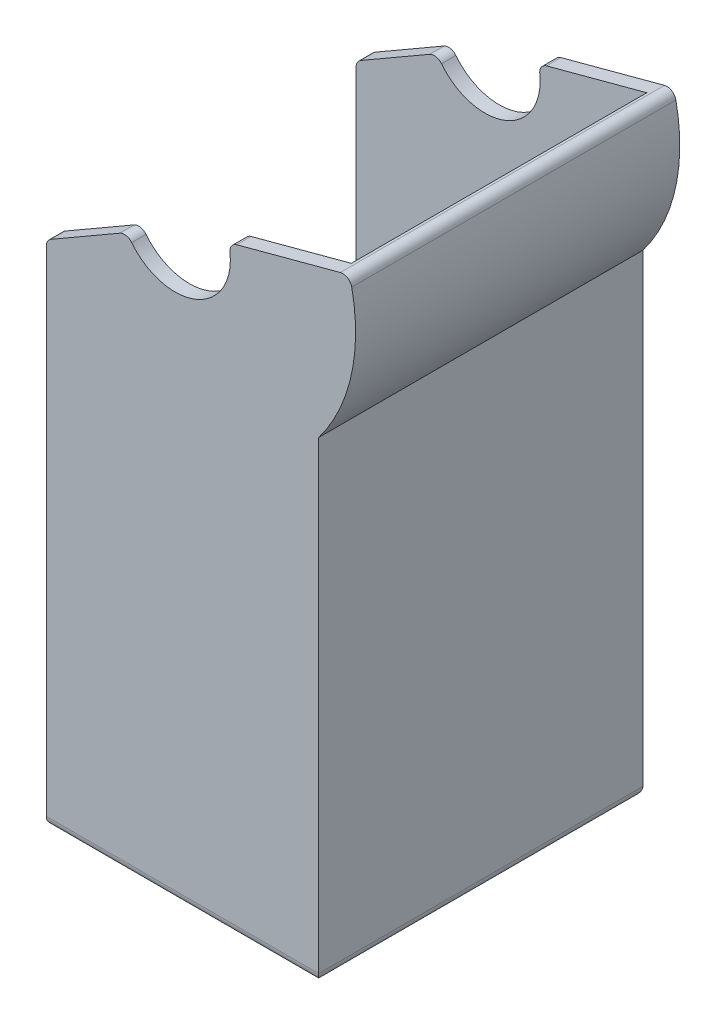
ISO-10303-21;
HEADER;
FILE_DESCRIPTION(('STEP AP214'),'2;1');
FILE_NAME('part.step','',(''),(''),'','','');
FILE_SCHEMA(('AUTOMOTIVE_DESIGN { 1 0 10303 214 1 1 1 1 }'));
ENDSEC;
DATA;
#1=APPLICATION_CONTEXT('core data for automotive mechanical design processes');
#2=APPLICATION_PROTOCOL_DEFINITION('international standard','automotive_design',2000,#1);
#3=PRODUCT_CONTEXT('',#1,'mechanical');
#4=PRODUCT('Part','Part','',(#3));
#5=PRODUCT_RELATED_PRODUCT_CATEGORY('part','',(#4));
#6=PRODUCT_DEFINITION_FORMATION('','',#4);
#7=PRODUCT_DEFINITION_CONTEXT('part definition',#1,'design');
#8=PRODUCT_DEFINITION('design','',#6,#7);
#9=PRODUCT_DEFINITION_SHAPE('','',#8);
#10=(LENGTH_UNIT() NAMED_UNIT(*) SI_UNIT(.MILLI.,.METRE.));
#11=(NAMED_UNIT(*) PLANE_ANGLE_UNIT() SI_UNIT($,.RADIAN.));
#12=(NAMED_UNIT(*) SI_UNIT($,.STERADIAN.) SOLID_ANGLE_UNIT());
#13=UNCERTAINTY_MEASURE_WITH_UNIT(LENGTH_MEASURE(1.E-05),#10,'distance_accuracy_value','');
#14=(GEOMETRIC_REPRESENTATION_CONTEXT(3) GLOBAL_UNCERTAINTY_ASSIGNED_CONTEXT((#13)) GLOBAL_UNIT_ASSIGNED_CONTEXT((#10,
#11,#12)) REPRESENTATION_CONTEXT('',''));
#15=CARTESIAN_POINT('',(0.,0.,0.));
#16=DIRECTION('',(0.,0.,1.));
#17=DIRECTION('',(1.,0.,0.));
#18=AXIS2_PLACEMENT_3D('',#15,#16,#17);
#19=CARTESIAN_POINT('',(38.97,-158.24,238.319982711232));
#20=DIRECTION('',(0.,-1.,0.));
#21=DIRECTION('',(0.,0.,-1.));
#22=AXIS2_PLACEMENT_3D('',#19,#20,#21);
#23=PLANE('',#22);
#24=DIRECTION('',(0.,0.,-1.));
#25=VECTOR('',#24,1.);
#26=CARTESIAN_POINT('',(36.47,-158.24,238.319982711232));
#27=LINE('',#26,#25);
#28=CARTESIAN_POINT('',(36.47,-158.24,2.5));
#29=VERTEX_POINT('',#28);
#30=CARTESIAN_POINT('',(36.47,-158.24,85.5));
#31=VERTEX_POINT('',#30);
#32=EDGE_CURVE('E282',#29,#31,#27,.F.);
#33=ORIENTED_EDGE('',*,*,#32,.T.);
#34=DIRECTION('',(-1.,0.,0.));
#35=VECTOR('',#34,1.);
#36=CARTESIAN_POINT('',(38.97,-158.24,85.5));
#37=LINE('',#36,#35);
#38=CARTESIAN_POINT('',(-34.97,-158.24,85.5));
#39=VERTEX_POINT('',#38);
#40=EDGE_CURVE('E203',#31,#39,#37,.T.);
#41=ORIENTED_EDGE('',*,*,#40,.T.);
#42=DIRECTION('',(0.,0.,-1.));
#43=VECTOR('',#42,1.);
#44=CARTESIAN_POINT('',(-34.97,-158.24,238.319982711232));
#45=LINE('',#44,#43);
#46=CARTESIAN_POINT('',(-34.97,-158.24,84.1));
#47=VERTEX_POINT('',#46);
#48=EDGE_CURVE('E197',#39,#47,#45,.T.);
#49=ORIENTED_EDGE('',*,*,#48,.T.);
#50=DIRECTION('',(-1.,0.,0.));
#51=VECTOR('',#50,1.);
#52=CARTESIAN_POINT('',(34.97,-158.24,84.1));
#53=LINE('',#52,#51);
#54=CARTESIAN_POINT('',(34.97,-158.24,84.1));
#55=VERTEX_POINT('',#54);
#56=EDGE_CURVE('E201',#55,#47,#53,.T.);
#57=ORIENTED_EDGE('',*,*,#56,.F.);
#58=DIRECTION('',(0.,0.,1.));
#59=VECTOR('',#58,1.);
#60=CARTESIAN_POINT('',(34.97,-158.24,-173.007228750709));
#61=LINE('',#60,#59);
#62=CARTESIAN_POINT('',(34.97,-158.24,3.89999999999993));
#63=VERTEX_POINT('',#62);
#64=EDGE_CURVE('E216',#63,#55,#61,.T.);
#65=ORIENTED_EDGE('',*,*,#64,.F.);
#66=DIRECTION('',(1.,0.,0.));
#67=VECTOR('',#66,1.);
#68=CARTESIAN_POINT('',(34.97,-158.24,3.89999999999999));
#69=LINE('',#68,#67);
#70=CARTESIAN_POINT('',(-34.97,-158.24,3.89999999999999));
#71=VERTEX_POINT('',#70);
#72=EDGE_CURVE('E229',#71,#63,#69,.T.);
#73=ORIENTED_EDGE('',*,*,#72,.F.);
#74=CARTESIAN_POINT('',(-34.97,-158.24,2.5));
#75=VERTEX_POINT('',#74);
#76=EDGE_CURVE('E206',#71,#75,#45,.T.);
#77=ORIENTED_EDGE('',*,*,#76,.T.);
#78=DIRECTION('',(-1.,0.,0.));
#79=VECTOR('',#78,1.);
#80=CARTESIAN_POINT('',(38.97,-158.24,2.5));
#81=LINE('',#80,#79);
#82=EDGE_CURVE('E284',#75,#29,#81,.F.);
#83=ORIENTED_EDGE('',*,*,#82,.T.);
#84=EDGE_LOOP('',(#33,#41,#49,#57,#65,#73,#77,#83));
#85=FACE_BOUND('',#84,.T.);
#86=ADVANCED_FACE('F40',(#85),#23,.T.);
#87=CARTESIAN_POINT('',(0.,0.,209.168433657794));
#88=DIRECTION('',(0.499999999999998,-0.86602540378444,0.));
#89=DIRECTION('',(0.86602540378444,0.499999999999998,0.));
#90=AXIS2_PLACEMENT_3D('',#87,#88,#89);
#91=PLANE('',#90);
#92=DIRECTION('',(-0.86602540378444,-0.499999999999998,0.));
#93=VECTOR('',#92,1.);
#94=CARTESIAN_POINT('',(0.,0.,88.));
#95=LINE('',#94,#93);
#96=CARTESIAN_POINT('',(-15.,-8.66025403784434,88.));
#97=VERTEX_POINT('',#96);
#98=CARTESIAN_POINT('',(-33.72,-19.4682510770741,88.));
#99=VERTEX_POINT('',#98);
#100=EDGE_CURVE('E265',#97,#99,#95,.T.);
#101=ORIENTED_EDGE('',*,*,#100,.F.);
#102=DIRECTION('',(0.,0.,-1.));
#103=VECTOR('',#102,1.);
#104=CARTESIAN_POINT('',(-15.,-8.66025403784434,209.168433657794));
#105=LINE('',#104,#103);
#106=CARTESIAN_POINT('',(-15.,-8.66025403784434,84.1));
#107=VERTEX_POINT('',#106);
#108=EDGE_CURVE('E340',#97,#107,#105,.T.);
#109=ORIENTED_EDGE('',*,*,#108,.T.);
#110=DIRECTION('',(-0.86602540378444,-0.499999999999998,0.));
#111=VECTOR('',#110,1.);
#112=CARTESIAN_POINT('',(0.,0.,84.1));
#113=LINE('',#112,#111);
#114=CARTESIAN_POINT('',(-33.72,-19.4682510770741,84.1));
#115=VERTEX_POINT('',#114);
#116=EDGE_CURVE('E274',#107,#115,#113,.T.);
#117=ORIENTED_EDGE('',*,*,#116,.T.);
#118=DIRECTION('',(0.,0.,-1.));
#119=VECTOR('',#118,1.);
#120=CARTESIAN_POINT('',(-33.72,-19.468251077074,88.));
#121=LINE('',#120,#119);
#122=EDGE_CURVE('E338',#115,#99,#121,.F.);
#123=ORIENTED_EDGE('',*,*,#122,.T.);
#124=EDGE_LOOP('',(#101,#109,#117,#123));
#125=FACE_BOUND('',#124,.T.);
#126=ADVANCED_FACE('F401',(#125),#91,.F.);
#127=DIRECTION('',(-0.86602540378444,-0.499999999999998,0.));
#128=VECTOR('',#127,1.);
#129=CARTESIAN_POINT('',(0.,0.,0.));
#130=LINE('',#129,#128);
#131=CARTESIAN_POINT('',(-15.,-8.66025403784434,0.));
#132=VERTEX_POINT('',#131);
#133=CARTESIAN_POINT('',(-33.72,-19.468251077074,0.));
#134=VERTEX_POINT('',#133);
#135=EDGE_CURVE('E256',#132,#134,#130,.T.);
#136=ORIENTED_EDGE('',*,*,#135,.T.);
#137=DIRECTION('',(0.,0.,-1.));
#138=VECTOR('',#137,1.);
#139=CARTESIAN_POINT('',(-33.72,-19.468251077074,3.89999999999999));
#140=LINE('',#139,#138);
#141=CARTESIAN_POINT('',(-33.72,-19.4682510770741,3.89999999999999));
#142=VERTEX_POINT('',#141);
#143=EDGE_CURVE('E346',#134,#142,#140,.F.);
#144=ORIENTED_EDGE('',*,*,#143,.T.);
#145=DIRECTION('',(-0.86602540378444,-0.499999999999998,0.));
#146=VECTOR('',#145,1.);
#147=CARTESIAN_POINT('',(0.,0.,3.89999999999999));
#148=LINE('',#147,#146);
#149=CARTESIAN_POINT('',(-15.,-8.66025403784434,3.89999999999999));
#150=VERTEX_POINT('',#149);
#151=EDGE_CURVE('E279',#150,#142,#148,.T.);
#152=ORIENTED_EDGE('',*,*,#151,.F.);
#153=DIRECTION('',(0.,0.,-1.));
#154=VECTOR('',#153,1.);
#155=CARTESIAN_POINT('',(-15.,-8.66025403784434,209.168433657794));
#156=LINE('',#155,#154);
#157=EDGE_CURVE('E343',#150,#132,#156,.T.);
#158=ORIENTED_EDGE('',*,*,#157,.T.);
#159=EDGE_LOOP('',(#136,#144,#152,#158));
#160=FACE_BOUND('',#159,.T.);
#161=ADVANCED_FACE('F438',(#160),#91,.F.);
#162=CARTESIAN_POINT('',(0.,0.,88.));
#163=DIRECTION('',(0.,0.,1.));
#164=DIRECTION('',(1.,0.,0.));
#165=AXIS2_PLACEMENT_3D('',#162,#163,#164);
#166=PLANE('',#165);
#167=DIRECTION('',(0.,1.,0.));
#168=VECTOR('',#167,1.);
#169=CARTESIAN_POINT('',(-34.97,11.7762665521649,88.));
#170=LINE('',#169,#168);
#171=CARTESIAN_POINT('',(-34.97,-155.74,88.));
#172=VERTEX_POINT('',#171);
#173=CARTESIAN_POINT('',(-34.97,-21.6333145865351,88.));
#174=VERTEX_POINT('',#173);
#175=EDGE_CURVE('E374',#172,#174,#170,.T.);
#176=ORIENTED_EDGE('',*,*,#175,.F.);
#177=DIRECTION('',(-1.,0.,0.));
#178=VECTOR('',#177,1.);
#179=CARTESIAN_POINT('',(0.,-155.74,88.));
#180=LINE('',#179,#178);
#181=CARTESIAN_POINT('',(38.97,-155.74,88.));
#182=VERTEX_POINT('',#181);
#183=EDGE_CURVE('E298',#172,#182,#180,.F.);
#184=ORIENTED_EDGE('',*,*,#183,.T.);
#185=DIRECTION('',(0.,-1.,0.));
#186=VECTOR('',#185,1.);
#187=CARTESIAN_POINT('',(38.97,-158.24,88.));
#188=LINE('',#187,#186);
#189=CARTESIAN_POINT('',(38.97,-29.7041933066697,88.));
#190=VERTEX_POINT('',#189);
#191=EDGE_CURVE('E253',#190,#182,#188,.T.);
#192=ORIENTED_EDGE('',*,*,#191,.F.);
#193=CARTESIAN_POINT('',(0.,0.,88.));
#194=DIRECTION('',(0.,0.,1.));
#195=DIRECTION('',(1.,0.,0.));
#196=AXIS2_PLACEMENT_3D('',#193,#194,#195);
#197=CIRCLE('',#196,49.);
#198=CARTESIAN_POINT('',(47.9437467146203,10.1191477390311,88.));
#199=VERTEX_POINT('',#198);
#200=EDGE_CURVE('E271',#190,#199,#197,.T.);
#201=ORIENTED_EDGE('',*,*,#200,.T.);
#202=CARTESIAN_POINT('',(45.4976371883641,9.60286469112135,88.));
#203=DIRECTION('',(0.,0.,1.));
#204=DIRECTION('',(1.,0.,0.));
#205=AXIS2_PLACEMENT_3D('',#202,#203,#204);
#206=CIRCLE('',#205,2.5);
#207=CARTESIAN_POINT('',(44.8505895756078,12.017679256844,88.));
#208=VERTEX_POINT('',#207);
#209=EDGE_CURVE('E296',#199,#208,#206,.T.);
#210=ORIENTED_EDGE('',*,*,#209,.T.);
#211=DIRECTION('',(-0.965925826289067,-0.258819045102524,0.));
#212=VECTOR('',#211,1.);
#213=CARTESIAN_POINT('',(0.,0.,88.));
#214=LINE('',#213,#212);
#215=CARTESIAN_POINT('',(16.7303260747561,4.48287736084033,88.));
#216=VERTEX_POINT('',#215);
#217=EDGE_CURVE('E262',#208,#216,#214,.T.);
#218=ORIENTED_EDGE('',*,*,#217,.T.);
#219=CARTESIAN_POINT('',(17.3773736875125,2.06806279511766,88.));
#220=DIRECTION('',(0.,0.,1.));
#221=DIRECTION('',(1.,0.,0.));
#222=AXIS2_PLACEMENT_3D('',#219,#220,#221);
#223=CIRCLE('',#222,2.5);
#224=CARTESIAN_POINT('',(14.8948917321535,1.77262525295799,88.));
#225=VERTEX_POINT('',#224);
#226=EDGE_CURVE('E294',#216,#225,#223,.T.);
#227=ORIENTED_EDGE('',*,*,#226,.T.);
#228=CARTESIAN_POINT('',(0.,0.,88.));
#229=DIRECTION('',(0.,0.,-1.));
#230=DIRECTION('',(-1.,0.,0.));
#231=AXIS2_PLACEMENT_3D('',#228,#229,#230);
#232=CIRCLE('',#231,15.);
#233=CARTESIAN_POINT('',(-11.7857142857143,-9.2788436119761,88.));
#234=VERTEX_POINT('',#233);
#235=EDGE_CURVE('E364',#225,#234,#232,.T.);
#236=ORIENTED_EDGE('',*,*,#235,.T.);
#237=CARTESIAN_POINT('',(-13.75,-10.8253175473054,88.));
#238=DIRECTION('',(0.,0.,1.));
#239=DIRECTION('',(1.,0.,0.));
#240=AXIS2_PLACEMENT_3D('',#237,#238,#239);
#241=CIRCLE('',#240,2.5);
#242=EDGE_CURVE('E292',#234,#97,#241,.T.);
#243=ORIENTED_EDGE('',*,*,#242,.T.);
#244=ORIENTED_EDGE('',*,*,#100,.T.);
#245=CARTESIAN_POINT('',(-32.47,-21.6333145865351,88.));
#246=DIRECTION('',(0.,0.,1.));
#247=DIRECTION('',(1.,0.,0.));
#248=AXIS2_PLACEMENT_3D('',#245,#246,#247);
#249=CIRCLE('',#248,2.5);
#250=EDGE_CURVE('E290',#99,#174,#249,.T.);
#251=ORIENTED_EDGE('',*,*,#250,.T.);
#252=EDGE_LOOP('',(#176,#184,#192,#201,#210,#218,#227,#236,#243,#244,#251));
#253=FACE_BOUND('',#252,.T.);
#254=ADVANCED_FACE('F393',(#253),#166,.T.);
#255=CARTESIAN_POINT('',(0.,0.,0.));
#256=DIRECTION('',(0.,0.,1.));
#257=DIRECTION('',(1.,0.,0.));
#258=AXIS2_PLACEMENT_3D('',#255,#256,#257);
#259=PLANE('',#258);
#260=DIRECTION('',(0.,-1.,0.));
#261=VECTOR('',#260,1.);
#262=CARTESIAN_POINT('',(38.97,-158.24,0.));
#263=LINE('',#262,#261);
#264=CARTESIAN_POINT('',(38.97,-29.7041933066697,0.));
#265=VERTEX_POINT('',#264);
#266=CARTESIAN_POINT('',(38.97,-155.74,0.));
#267=VERTEX_POINT('',#266);
#268=EDGE_CURVE('E249',#265,#267,#263,.T.);
#269=ORIENTED_EDGE('',*,*,#268,.T.);
#270=DIRECTION('',(-1.,0.,0.));
#271=VECTOR('',#270,1.);
#272=CARTESIAN_POINT('',(-34.97,-155.74,0.));
#273=LINE('',#272,#271);
#274=CARTESIAN_POINT('',(-34.97,-155.74,0.));
#275=VERTEX_POINT('',#274);
#276=EDGE_CURVE('E308',#267,#275,#273,.T.);
#277=ORIENTED_EDGE('',*,*,#276,.T.);
#278=DIRECTION('',(0.,-1.,0.));
#279=VECTOR('',#278,1.);
#280=CARTESIAN_POINT('',(-34.97,11.7762665521649,0.));
#281=LINE('',#280,#279);
#282=CARTESIAN_POINT('',(-34.97,-21.6333145865351,0.));
#283=VERTEX_POINT('',#282);
#284=EDGE_CURVE('E376',#283,#275,#281,.T.);
#285=ORIENTED_EDGE('',*,*,#284,.F.);
#286=CARTESIAN_POINT('',(-32.47,-21.6333145865351,0.));
#287=DIRECTION('',(0.,0.,1.));
#288=DIRECTION('',(1.,0.,0.));
#289=AXIS2_PLACEMENT_3D('',#286,#287,#288);
#290=CIRCLE('',#289,2.5);
#291=EDGE_CURVE('E304',#283,#134,#290,.F.);
#292=ORIENTED_EDGE('',*,*,#291,.T.);
#293=ORIENTED_EDGE('',*,*,#135,.F.);
#294=CARTESIAN_POINT('',(-13.75,-10.8253175473054,0.));
#295=DIRECTION('',(0.,0.,1.));
#296=DIRECTION('',(1.,0.,0.));
#297=AXIS2_PLACEMENT_3D('',#294,#295,#296);
#298=CIRCLE('',#297,2.5);
#299=CARTESIAN_POINT('',(-11.7857142857143,-9.2788436119761,0.));
#300=VERTEX_POINT('',#299);
#301=EDGE_CURVE('E302',#132,#300,#298,.F.);
#302=ORIENTED_EDGE('',*,*,#301,.T.);
#303=CARTESIAN_POINT('',(0.,0.,0.));
#304=DIRECTION('',(0.,0.,-1.));
#305=DIRECTION('',(-1.,0.,0.));
#306=AXIS2_PLACEMENT_3D('',#303,#304,#305);
#307=CIRCLE('',#306,15.);
#308=CARTESIAN_POINT('',(14.8948917321535,1.77262525295799,0.));
#309=VERTEX_POINT('',#308);
#310=EDGE_CURVE('E359',#309,#300,#307,.T.);
#311=ORIENTED_EDGE('',*,*,#310,.F.);
#312=CARTESIAN_POINT('',(17.3773736875125,2.06806279511766,0.));
#313=DIRECTION('',(0.,0.,1.));
#314=DIRECTION('',(1.,0.,0.));
#315=AXIS2_PLACEMENT_3D('',#312,#313,#314);
#316=CIRCLE('',#315,2.5);
#317=CARTESIAN_POINT('',(16.7303260747561,4.48287736084033,0.));
#318=VERTEX_POINT('',#317);
#319=EDGE_CURVE('E300',#309,#318,#316,.F.);
#320=ORIENTED_EDGE('',*,*,#319,.T.);
#321=DIRECTION('',(-0.965925826289067,-0.258819045102524,0.));
#322=VECTOR('',#321,1.);
#323=CARTESIAN_POINT('',(0.,0.,0.));
#324=LINE('',#323,#322);
#325=CARTESIAN_POINT('',(44.8505895756078,12.017679256844,0.));
#326=VERTEX_POINT('',#325);
#327=EDGE_CURVE('E259',#326,#318,#324,.T.);
#328=ORIENTED_EDGE('',*,*,#327,.F.);
#329=CARTESIAN_POINT('',(45.4976371883641,9.60286469112135,0.));
#330=DIRECTION('',(0.,0.,1.));
#331=DIRECTION('',(1.,0.,0.));
#332=AXIS2_PLACEMENT_3D('',#329,#330,#331);
#333=CIRCLE('',#332,2.5);
#334=CARTESIAN_POINT('',(47.9437467146203,10.1191477390311,0.));
#335=VERTEX_POINT('',#334);
#336=EDGE_CURVE('E306',#326,#335,#333,.F.);
#337=ORIENTED_EDGE('',*,*,#336,.T.);
#338=CARTESIAN_POINT('',(0.,0.,0.));
#339=DIRECTION('',(0.,0.,1.));
#340=DIRECTION('',(1.,0.,0.));
#341=AXIS2_PLACEMENT_3D('',#338,#339,#340);
#342=CIRCLE('',#341,49.);
#343=EDGE_CURVE('E268',#265,#335,#342,.T.);
#344=ORIENTED_EDGE('',*,*,#343,.F.);
#345=EDGE_LOOP('',(#269,#277,#285,#292,#293,#302,#311,#320,#328,#337,#344));
#346=FACE_BOUND('',#345,.T.);
#347=ADVANCED_FACE('F436',(#346),#259,.F.);
#348=CARTESIAN_POINT('',(0.,0.,3.9));
#349=DIRECTION('',(0.,0.,1.));
#350=DIRECTION('',(1.,0.,0.));
#351=AXIS2_PLACEMENT_3D('',#348,#349,#350);
#352=PLANE('',#351);
#353=ORIENTED_EDGE('',*,*,#151,.T.);
#354=CARTESIAN_POINT('',(-32.47,-21.6333145865351,3.9));
#355=DIRECTION('',(0.,0.,1.));
#356=DIRECTION('',(1.,0.,0.));
#357=AXIS2_PLACEMENT_3D('',#354,#355,#356);
#358=CIRCLE('',#357,2.5);
#359=CARTESIAN_POINT('',(-34.97,-21.6333145865351,3.89999999999999));
#360=VERTEX_POINT('',#359);
#361=EDGE_CURVE('E351',#142,#360,#358,.T.);
#362=ORIENTED_EDGE('',*,*,#361,.T.);
#363=DIRECTION('',(0.,-1.,0.));
#364=VECTOR('',#363,1.);
#365=CARTESIAN_POINT('',(-34.97,0.,3.89999999999999));
#366=LINE('',#365,#364);
#367=EDGE_CURVE('E228',#360,#71,#366,.T.);
#368=ORIENTED_EDGE('',*,*,#367,.T.);
#369=ORIENTED_EDGE('',*,*,#72,.T.);
#370=DIRECTION('',(0.,1.,0.));
#371=VECTOR('',#370,1.);
#372=CARTESIAN_POINT('',(34.97,0.,3.89999999999999));
#373=LINE('',#372,#371);
#374=CARTESIAN_POINT('',(34.97,-29.1092614128219,3.89999999999999));
#375=VERTEX_POINT('',#374);
#376=EDGE_CURVE('E225',#63,#375,#373,.T.);
#377=ORIENTED_EDGE('',*,*,#376,.T.);
#378=CARTESIAN_POINT('',(0.,0.,3.89999999999999));
#379=DIRECTION('',(0.,0.,1.));
#380=DIRECTION('',(1.,0.,0.));
#381=AXIS2_PLACEMENT_3D('',#378,#379,#380);
#382=CIRCLE('',#381,45.5);
#383=CARTESIAN_POINT('',(43.9496250961526,11.7762665521649,3.89999999999999));
#384=VERTEX_POINT('',#383);
#385=EDGE_CURVE('E239',#375,#384,#382,.T.);
#386=ORIENTED_EDGE('',*,*,#385,.T.);
#387=DIRECTION('',(-0.965925826289067,-0.258819045102524,0.));
#388=VECTOR('',#387,1.);
#389=CARTESIAN_POINT('',(0.,0.,3.89999999999999));
#390=LINE('',#389,#388);
#391=CARTESIAN_POINT('',(16.7303260747561,4.48287736084033,3.89999999999999));
#392=VERTEX_POINT('',#391);
#393=EDGE_CURVE('E244',#384,#392,#390,.T.);
#394=ORIENTED_EDGE('',*,*,#393,.T.);
#395=CARTESIAN_POINT('',(17.3773736875125,2.06806279511766,3.9));
#396=DIRECTION('',(0.,0.,1.));
#397=DIRECTION('',(1.,0.,0.));
#398=AXIS2_PLACEMENT_3D('',#395,#396,#397);
#399=CIRCLE('',#398,2.5);
#400=CARTESIAN_POINT('',(14.8948917321535,1.77262525295799,3.9));
#401=VERTEX_POINT('',#400);
#402=EDGE_CURVE('E57',#392,#401,#399,.T.);
#403=ORIENTED_EDGE('',*,*,#402,.T.);
#404=CARTESIAN_POINT('',(0.,0.,3.9));
#405=DIRECTION('',(0.,0.,1.));
#406=DIRECTION('',(1.,0.,0.));
#407=AXIS2_PLACEMENT_3D('',#404,#405,#406);
#408=CIRCLE('',#407,15.);
#409=CARTESIAN_POINT('',(-11.7857142857143,-9.2788436119761,3.9));
#410=VERTEX_POINT('',#409);
#411=EDGE_CURVE('E372',#410,#401,#408,.T.);
#412=ORIENTED_EDGE('',*,*,#411,.F.);
#413=CARTESIAN_POINT('',(-13.75,-10.8253175473054,3.9));
#414=DIRECTION('',(0.,0.,1.));
#415=DIRECTION('',(1.,0.,0.));
#416=AXIS2_PLACEMENT_3D('',#413,#414,#415);
#417=CIRCLE('',#416,2.5);
#418=EDGE_CURVE('E349',#410,#150,#417,.T.);
#419=ORIENTED_EDGE('',*,*,#418,.T.);
#420=EDGE_LOOP('',(#353,#362,#368,#369,#377,#386,#394,#403,#412,#419));
#421=FACE_BOUND('',#420,.T.);
#422=ADVANCED_FACE('F427',(#421),#352,.T.);
#423=CARTESIAN_POINT('',(0.,0.,84.1));
#424=DIRECTION('',(0.,0.,1.));
#425=DIRECTION('',(1.,0.,0.));
#426=AXIS2_PLACEMENT_3D('',#423,#424,#425);
#427=PLANE('',#426);
#428=CARTESIAN_POINT('',(0.,0.,84.1));
#429=DIRECTION('',(0.,0.,1.));
#430=DIRECTION('',(1.,0.,0.));
#431=AXIS2_PLACEMENT_3D('',#428,#429,#430);
#432=CIRCLE('',#431,15.);
#433=CARTESIAN_POINT('',(-11.7857142857143,-9.2788436119761,84.1));
#434=VERTEX_POINT('',#433);
#435=CARTESIAN_POINT('',(14.8948917321535,1.77262525295799,84.1));
#436=VERTEX_POINT('',#435);
#437=EDGE_CURVE('E368',#434,#436,#432,.T.);
#438=ORIENTED_EDGE('',*,*,#437,.T.);
#439=CARTESIAN_POINT('',(17.3773736875125,2.06806279511766,84.1));
#440=DIRECTION('',(0.,0.,1.));
#441=DIRECTION('',(1.,0.,0.));
#442=AXIS2_PLACEMENT_3D('',#439,#440,#441);
#443=CIRCLE('',#442,2.5);
#444=CARTESIAN_POINT('',(16.7303260747561,4.48287736084033,84.1));
#445=VERTEX_POINT('',#444);
#446=EDGE_CURVE('E336',#436,#445,#443,.F.);
#447=ORIENTED_EDGE('',*,*,#446,.T.);
#448=DIRECTION('',(-0.965925826289067,-0.258819045102524,0.));
#449=VECTOR('',#448,1.);
#450=CARTESIAN_POINT('',(0.,0.,84.1));
#451=LINE('',#450,#449);
#452=CARTESIAN_POINT('',(43.9496250961526,11.7762665521649,84.1));
#453=VERTEX_POINT('',#452);
#454=EDGE_CURVE('E241',#453,#445,#451,.T.);
#455=ORIENTED_EDGE('',*,*,#454,.F.);
#456=CARTESIAN_POINT('',(0.,0.,84.1));
#457=DIRECTION('',(0.,0.,1.));
#458=DIRECTION('',(1.,0.,0.));
#459=AXIS2_PLACEMENT_3D('',#456,#457,#458);
#460=CIRCLE('',#459,45.5);
#461=CARTESIAN_POINT('',(34.97,-29.1092614128219,84.1));
#462=VERTEX_POINT('',#461);
#463=EDGE_CURVE('E237',#453,#462,#460,.F.);
#464=ORIENTED_EDGE('',*,*,#463,.T.);
#465=DIRECTION('',(0.,-1.,0.));
#466=VECTOR('',#465,1.);
#467=CARTESIAN_POINT('',(34.97,0.,84.1));
#468=LINE('',#467,#466);
#469=EDGE_CURVE('E205',#462,#55,#468,.T.);
#470=ORIENTED_EDGE('',*,*,#469,.T.);
#471=ORIENTED_EDGE('',*,*,#56,.T.);
#472=DIRECTION('',(0.,1.,0.));
#473=VECTOR('',#472,1.);
#474=CARTESIAN_POINT('',(-34.97,0.,84.1));
#475=LINE('',#474,#473);
#476=CARTESIAN_POINT('',(-34.97,-21.6333145865351,84.1));
#477=VERTEX_POINT('',#476);
#478=EDGE_CURVE('E210',#47,#477,#475,.T.);
#479=ORIENTED_EDGE('',*,*,#478,.T.);
#480=CARTESIAN_POINT('',(-32.47,-21.6333145865351,84.1));
#481=DIRECTION('',(0.,0.,1.));
#482=DIRECTION('',(1.,0.,0.));
#483=AXIS2_PLACEMENT_3D('',#480,#481,#482);
#484=CIRCLE('',#483,2.5);
#485=EDGE_CURVE('E332',#477,#115,#484,.F.);
#486=ORIENTED_EDGE('',*,*,#485,.T.);
#487=ORIENTED_EDGE('',*,*,#116,.F.);
#488=CARTESIAN_POINT('',(-13.75,-10.8253175473054,84.1));
#489=DIRECTION('',(0.,0.,1.));
#490=DIRECTION('',(1.,0.,0.));
#491=AXIS2_PLACEMENT_3D('',#488,#489,#490);
#492=CIRCLE('',#491,2.5);
#493=EDGE_CURVE('E334',#107,#434,#492,.F.);
#494=ORIENTED_EDGE('',*,*,#493,.T.);
#495=EDGE_LOOP('',(#438,#447,#455,#464,#470,#471,#479,#486,#487,#494));
#496=FACE_BOUND('',#495,.T.);
#497=ADVANCED_FACE('F220',(#496),#427,.F.);
#498=CARTESIAN_POINT('',(0.,0.,-128.693434175952));
#499=DIRECTION('',(0.,0.,1.));
#500=DIRECTION('',(1.,0.,0.));
#501=AXIS2_PLACEMENT_3D('',#498,#499,#500);
#502=CYLINDRICAL_SURFACE('',#501,45.5);
#503=ORIENTED_EDGE('',*,*,#385,.F.);
#504=DIRECTION('',(0.,0.,1.));
#505=VECTOR('',#504,1.);
#506=CARTESIAN_POINT('',(34.97,-29.1092614128219,-128.693434175952));
#507=LINE('',#506,#505);
#508=EDGE_CURVE('E231',#375,#462,#507,.T.);
#509=ORIENTED_EDGE('',*,*,#508,.T.);
#510=ORIENTED_EDGE('',*,*,#463,.F.);
#511=DIRECTION('',(0.,0.,1.));
#512=VECTOR('',#511,1.);
#513=CARTESIAN_POINT('',(43.9496250961526,11.7762665521649,-128.693434175952));
#514=LINE('',#513,#512);
#515=EDGE_CURVE('E246',#453,#384,#514,.F.);
#516=ORIENTED_EDGE('',*,*,#515,.T.);
#517=EDGE_LOOP('',(#503,#509,#510,#516));
#518=FACE_BOUND('',#517,.T.);
#519=ADVANCED_FACE('F424',(#518),#502,.F.);
#520=CARTESIAN_POINT('',(0.,0.,209.168433657794));
#521=DIRECTION('',(0.258819045102524,-0.965925826289067,0.));
#522=DIRECTION('',(0.965925826289067,0.258819045102524,0.));
#523=AXIS2_PLACEMENT_3D('',#520,#521,#522);
#524=PLANE('',#523);
#525=ORIENTED_EDGE('',*,*,#217,.F.);
#526=DIRECTION('',(0.,0.,-1.));
#527=VECTOR('',#526,1.);
#528=CARTESIAN_POINT('',(44.8505895756078,12.017679256844,209.168433657794));
#529=LINE('',#528,#527);
#530=EDGE_CURVE('E323',#208,#326,#529,.T.);
#531=ORIENTED_EDGE('',*,*,#530,.T.);
#532=ORIENTED_EDGE('',*,*,#327,.T.);
#533=DIRECTION('',(0.,0.,-1.));
#534=VECTOR('',#533,1.);
#535=CARTESIAN_POINT('',(16.7303260747561,4.48287736084033,209.168433657794));
#536=LINE('',#535,#534);
#537=EDGE_CURVE('E317',#318,#392,#536,.F.);
#538=ORIENTED_EDGE('',*,*,#537,.T.);
#539=ORIENTED_EDGE('',*,*,#393,.F.);
#540=ORIENTED_EDGE('',*,*,#515,.F.);
#541=ORIENTED_EDGE('',*,*,#454,.T.);
#542=DIRECTION('',(0.,0.,-1.));
#543=VECTOR('',#542,1.);
#544=CARTESIAN_POINT('',(16.7303260747561,4.48287736084033,209.168433657794));
#545=LINE('',#544,#543);
#546=EDGE_CURVE('E320',#445,#216,#545,.F.);
#547=ORIENTED_EDGE('',*,*,#546,.T.);
#548=EDGE_LOOP('',(#525,#531,#532,#538,#539,#540,#541,#547));
#549=FACE_BOUND('',#548,.T.);
#550=ADVANCED_FACE('F420',(#549),#524,.F.);
#551=CARTESIAN_POINT('',(0.,0.,88.));
#552=DIRECTION('',(0.,0.,-1.));
#553=DIRECTION('',(-1.,0.,0.));
#554=AXIS2_PLACEMENT_3D('',#551,#552,#553);
#555=CYLINDRICAL_SURFACE('',#554,49.);
#556=ORIENTED_EDGE('',*,*,#343,.T.);
#557=DIRECTION('',(0.,0.,-1.));
#558=VECTOR('',#557,1.);
#559=CARTESIAN_POINT('',(47.9437467146203,10.1191477390311,88.));
#560=LINE('',#559,#558);
#561=EDGE_CURVE('E326',#335,#199,#560,.F.);
#562=ORIENTED_EDGE('',*,*,#561,.T.);
#563=ORIENTED_EDGE('',*,*,#200,.F.);
#564=DIRECTION('',(0.,0.,-1.));
#565=VECTOR('',#564,1.);
#566=CARTESIAN_POINT('',(38.97,-29.7041933066697,238.319982711232));
#567=LINE('',#566,#565);
#568=EDGE_CURVE('E252',#190,#265,#567,.T.);
#569=ORIENTED_EDGE('',*,*,#568,.T.);
#570=EDGE_LOOP('',(#556,#562,#563,#569));
#571=FACE_BOUND('',#570,.T.);
#572=ADVANCED_FACE('F454',(#571),#555,.T.);
#573=CARTESIAN_POINT('',(38.97,-158.24,238.319982711232));
#574=DIRECTION('',(1.,0.,0.));
#575=DIRECTION('',(0.,1.,0.));
#576=AXIS2_PLACEMENT_3D('',#573,#574,#575);
#577=PLANE('',#576);
#578=ORIENTED_EDGE('',*,*,#191,.T.);
#579=DIRECTION('',(0.,0.,-1.));
#580=VECTOR('',#579,1.);
#581=CARTESIAN_POINT('',(38.97,-155.74,238.319982711232));
#582=LINE('',#581,#580);
#583=EDGE_CURVE('E315',#182,#267,#582,.T.);
#584=ORIENTED_EDGE('',*,*,#583,.T.);
#585=ORIENTED_EDGE('',*,*,#268,.F.);
#586=ORIENTED_EDGE('',*,*,#568,.F.);
#587=EDGE_LOOP('',(#578,#584,#585,#586));
#588=FACE_BOUND('',#587,.T.);
#589=ADVANCED_FACE('F460',(#588),#577,.T.);
#590=CARTESIAN_POINT('',(34.97,0.,-173.007228750709));
#591=DIRECTION('',(-1.,0.,0.));
#592=DIRECTION('',(0.,-1.,0.));
#593=AXIS2_PLACEMENT_3D('',#590,#591,#592);
#594=PLANE('',#593);
#595=ORIENTED_EDGE('',*,*,#376,.F.);
#596=ORIENTED_EDGE('',*,*,#64,.T.);
#597=ORIENTED_EDGE('',*,*,#469,.F.);
#598=ORIENTED_EDGE('',*,*,#508,.F.);
#599=EDGE_LOOP('',(#595,#596,#597,#598));
#600=FACE_BOUND('',#599,.T.);
#601=ADVANCED_FACE('F426',(#600),#594,.T.);
#602=CARTESIAN_POINT('',(-34.97,0.,0.));
#603=DIRECTION('',(-1.,0.,0.));
#604=DIRECTION('',(0.,-1.,0.));
#605=AXIS2_PLACEMENT_3D('',#602,#603,#604);
#606=PLANE('',#605);
#607=ORIENTED_EDGE('',*,*,#48,.F.);
#608=CARTESIAN_POINT('',(-34.97,-155.74,85.5));
#609=DIRECTION('',(-1.,0.,0.));
#610=DIRECTION('',(0.,-1.,0.));
#611=AXIS2_PLACEMENT_3D('',#608,#609,#610);
#612=CIRCLE('',#611,2.5);
#613=EDGE_CURVE('E288',#39,#172,#612,.T.);
#614=ORIENTED_EDGE('',*,*,#613,.T.);
#615=ORIENTED_EDGE('',*,*,#175,.T.);
#616=DIRECTION('',(0.,0.,-1.));
#617=VECTOR('',#616,1.);
#618=CARTESIAN_POINT('',(-34.97,-21.6333145865351,84.1));
#619=LINE('',#618,#617);
#620=EDGE_CURVE('E214',#174,#477,#619,.T.);
#621=ORIENTED_EDGE('',*,*,#620,.T.);
#622=ORIENTED_EDGE('',*,*,#478,.F.);
#623=EDGE_LOOP('',(#607,#614,#615,#621,#622));
#624=FACE_BOUND('',#623,.T.);
#625=ADVANCED_FACE('F211',(#624),#606,.T.);
#626=ORIENTED_EDGE('',*,*,#284,.T.);
#627=CARTESIAN_POINT('',(-34.97,-155.74,2.5));
#628=DIRECTION('',(-1.,0.,0.));
#629=DIRECTION('',(0.,-1.,0.));
#630=AXIS2_PLACEMENT_3D('',#627,#628,#629);
#631=CIRCLE('',#630,2.5);
#632=EDGE_CURVE('E313',#275,#75,#631,.T.);
#633=ORIENTED_EDGE('',*,*,#632,.T.);
#634=ORIENTED_EDGE('',*,*,#76,.F.);
#635=ORIENTED_EDGE('',*,*,#367,.F.);
#636=DIRECTION('',(0.,0.,-1.));
#637=VECTOR('',#636,1.);
#638=CARTESIAN_POINT('',(-34.97,-21.6333145865351,0.));
#639=LINE('',#638,#637);
#640=EDGE_CURVE('E310',#360,#283,#639,.T.);
#641=ORIENTED_EDGE('',*,*,#640,.T.);
#642=EDGE_LOOP('',(#626,#633,#634,#635,#641));
#643=FACE_BOUND('',#642,.T.);
#644=ADVANCED_FACE('F430',(#643),#606,.T.);
#645=CARTESIAN_POINT('',(0.,0.,88.));
#646=DIRECTION('',(0.,0.,-1.));
#647=DIRECTION('',(-1.,0.,0.));
#648=AXIS2_PLACEMENT_3D('',#645,#646,#647);
#649=CYLINDRICAL_SURFACE('',#648,15.);
#650=ORIENTED_EDGE('',*,*,#235,.F.);
#651=DIRECTION('',(0.,0.,-1.));
#652=VECTOR('',#651,1.);
#653=CARTESIAN_POINT('',(14.8948917321535,1.77262525295799,88.));
#654=LINE('',#653,#652);
#655=EDGE_CURVE('E330',#225,#436,#654,.T.);
#656=ORIENTED_EDGE('',*,*,#655,.T.);
#657=ORIENTED_EDGE('',*,*,#437,.F.);
#658=DIRECTION('',(0.,0.,-1.));
#659=VECTOR('',#658,1.);
#660=CARTESIAN_POINT('',(-11.7857142857143,-9.2788436119761,88.));
#661=LINE('',#660,#659);
#662=EDGE_CURVE('E328',#434,#234,#661,.F.);
#663=ORIENTED_EDGE('',*,*,#662,.T.);
#664=EDGE_LOOP('',(#650,#656,#657,#663));
#665=FACE_BOUND('',#664,.T.);
#666=ADVANCED_FACE('F411',(#665),#649,.F.);
#667=ORIENTED_EDGE('',*,*,#310,.T.);
#668=DIRECTION('',(0.,0.,-1.));
#669=VECTOR('',#668,1.);
#670=CARTESIAN_POINT('',(-11.7857142857143,-9.2788436119761,88.));
#671=LINE('',#670,#669);
#672=EDGE_CURVE('E12',#300,#410,#671,.F.);
#673=ORIENTED_EDGE('',*,*,#672,.T.);
#674=ORIENTED_EDGE('',*,*,#411,.T.);
#675=DIRECTION('',(0.,0.,-1.));
#676=VECTOR('',#675,1.);
#677=CARTESIAN_POINT('',(14.8948917321535,1.77262525295799,88.));
#678=LINE('',#677,#676);
#679=EDGE_CURVE('E49',#401,#309,#678,.T.);
#680=ORIENTED_EDGE('',*,*,#679,.T.);
#681=EDGE_LOOP('',(#667,#673,#674,#680));
#682=FACE_BOUND('',#681,.T.);
#683=ADVANCED_FACE('F484',(#682),#649,.F.);
#684=CARTESIAN_POINT('',(0.,-155.74,2.5));
#685=DIRECTION('',(1.,0.,0.));
#686=DIRECTION('',(0.,0.,-1.));
#687=AXIS2_PLACEMENT_3D('',#684,#685,#686);
#688=CYLINDRICAL_SURFACE('',#687,2.5);
#689=ORIENTED_EDGE('',*,*,#632,.F.);
#690=ORIENTED_EDGE('',*,*,#276,.F.);
#691=CARTESIAN_POINT('',(36.47,-155.74,2.5));
#692=DIRECTION('',(-0.707106781186547,0.,-0.707106781186547));
#693=DIRECTION('',(0.707106781186547,0.,-0.707106781186547));
#694=AXIS2_PLACEMENT_3D('',#691,#692,#693);
#695=ELLIPSE('',#694,3.53553390593274,2.5);
#696=EDGE_CURVE('E44',#29,#267,#695,.F.);
#697=ORIENTED_EDGE('',*,*,#696,.F.);
#698=ORIENTED_EDGE('',*,*,#82,.F.);
#699=EDGE_LOOP('',(#689,#690,#697,#698));
#700=FACE_BOUND('',#699,.T.);
#701=ADVANCED_FACE('F387',(#700),#688,.T.);
#702=CARTESIAN_POINT('',(36.47,-155.74,238.319982711232));
#703=DIRECTION('',(0.,0.,-1.));
#704=DIRECTION('',(-1.,0.,0.));
#705=AXIS2_PLACEMENT_3D('',#702,#703,#704);
#706=CYLINDRICAL_SURFACE('',#705,2.5);
#707=ORIENTED_EDGE('',*,*,#696,.T.);
#708=ORIENTED_EDGE('',*,*,#583,.F.);
#709=CARTESIAN_POINT('',(36.47,-155.74,85.5));
#710=DIRECTION('',(0.707106781186547,0.,-0.707106781186547));
#711=DIRECTION('',(-0.707106781186547,0.,-0.707106781186547));
#712=AXIS2_PLACEMENT_3D('',#709,#710,#711);
#713=ELLIPSE('',#712,3.53553390593274,2.5);
#714=EDGE_CURVE('E353',#31,#182,#713,.F.);
#715=ORIENTED_EDGE('',*,*,#714,.F.);
#716=ORIENTED_EDGE('',*,*,#32,.F.);
#717=EDGE_LOOP('',(#707,#708,#715,#716));
#718=FACE_BOUND('',#717,.T.);
#719=ADVANCED_FACE('F389',(#718),#706,.T.);
#720=CARTESIAN_POINT('',(38.97,-155.74,85.5));
#721=DIRECTION('',(-1.,0.,0.));
#722=DIRECTION('',(0.,0.,1.));
#723=AXIS2_PLACEMENT_3D('',#720,#721,#722);
#724=CYLINDRICAL_SURFACE('',#723,2.5);
#725=ORIENTED_EDGE('',*,*,#714,.T.);
#726=ORIENTED_EDGE('',*,*,#183,.F.);
#727=ORIENTED_EDGE('',*,*,#613,.F.);
#728=ORIENTED_EDGE('',*,*,#40,.F.);
#729=EDGE_LOOP('',(#725,#726,#727,#728));
#730=FACE_BOUND('',#729,.T.);
#731=ADVANCED_FACE('F390',(#730),#724,.T.);
#732=CARTESIAN_POINT('',(45.4976371883641,9.60286469112135,88.));
#733=DIRECTION('',(0.,0.,-1.));
#734=DIRECTION('',(-1.,0.,0.));
#735=AXIS2_PLACEMENT_3D('',#732,#733,#734);
#736=CYLINDRICAL_SURFACE('',#735,2.5);
#737=ORIENTED_EDGE('',*,*,#209,.F.);
#738=ORIENTED_EDGE('',*,*,#561,.F.);
#739=ORIENTED_EDGE('',*,*,#336,.F.);
#740=ORIENTED_EDGE('',*,*,#530,.F.);
#741=EDGE_LOOP('',(#737,#738,#739,#740));
#742=FACE_BOUND('',#741,.T.);
#743=ADVANCED_FACE('F458',(#742),#736,.T.);
#744=CARTESIAN_POINT('',(17.3773736875125,2.06806279511766,88.));
#745=DIRECTION('',(0.,0.,-1.));
#746=DIRECTION('',(-1.,0.,0.));
#747=AXIS2_PLACEMENT_3D('',#744,#745,#746);
#748=CYLINDRICAL_SURFACE('',#747,2.5);
#749=ORIENTED_EDGE('',*,*,#446,.F.);
#750=ORIENTED_EDGE('',*,*,#655,.F.);
#751=ORIENTED_EDGE('',*,*,#226,.F.);
#752=ORIENTED_EDGE('',*,*,#546,.F.);
#753=EDGE_LOOP('',(#749,#750,#751,#752));
#754=FACE_BOUND('',#753,.T.);
#755=ADVANCED_FACE('F414',(#754),#748,.T.);
#756=CARTESIAN_POINT('',(-13.75,-10.8253175473054,88.));
#757=DIRECTION('',(0.,0.,-1.));
#758=DIRECTION('',(-1.,0.,0.));
#759=AXIS2_PLACEMENT_3D('',#756,#757,#758);
#760=CYLINDRICAL_SURFACE('',#759,2.5);
#761=ORIENTED_EDGE('',*,*,#242,.F.);
#762=ORIENTED_EDGE('',*,*,#662,.F.);
#763=ORIENTED_EDGE('',*,*,#493,.F.);
#764=ORIENTED_EDGE('',*,*,#108,.F.);
#765=EDGE_LOOP('',(#761,#762,#763,#764));
#766=FACE_BOUND('',#765,.T.);
#767=ADVANCED_FACE('F405',(#766),#760,.T.);
#768=CARTESIAN_POINT('',(-32.47,-21.6333145865351,0.));
#769=DIRECTION('',(0.,0.,1.));
#770=DIRECTION('',(1.,0.,0.));
#771=AXIS2_PLACEMENT_3D('',#768,#769,#770);
#772=CYLINDRICAL_SURFACE('',#771,2.5);
#773=ORIENTED_EDGE('',*,*,#250,.F.);
#774=ORIENTED_EDGE('',*,*,#122,.F.);
#775=ORIENTED_EDGE('',*,*,#485,.F.);
#776=ORIENTED_EDGE('',*,*,#620,.F.);
#777=EDGE_LOOP('',(#773,#774,#775,#776));
#778=FACE_BOUND('',#777,.T.);
#779=ADVANCED_FACE('F398',(#778),#772,.T.);
#780=CARTESIAN_POINT('',(-32.47,-21.6333145865351,0.));
#781=DIRECTION('',(0.,0.,1.));
#782=DIRECTION('',(1.,0.,0.));
#783=AXIS2_PLACEMENT_3D('',#780,#781,#782);
#784=CYLINDRICAL_SURFACE('',#783,2.5);
#785=ORIENTED_EDGE('',*,*,#361,.F.);
#786=ORIENTED_EDGE('',*,*,#143,.F.);
#787=ORIENTED_EDGE('',*,*,#291,.F.);
#788=ORIENTED_EDGE('',*,*,#640,.F.);
#789=EDGE_LOOP('',(#785,#786,#787,#788));
#790=FACE_BOUND('',#789,.T.);
#791=ADVANCED_FACE('F432',(#790),#784,.T.);
#792=CARTESIAN_POINT('',(-13.75,-10.8253175473054,88.));
#793=DIRECTION('',(0.,0.,-1.));
#794=DIRECTION('',(-1.,0.,0.));
#795=AXIS2_PLACEMENT_3D('',#792,#793,#794);
#796=CYLINDRICAL_SURFACE('',#795,2.5);
#797=ORIENTED_EDGE('',*,*,#418,.F.);
#798=ORIENTED_EDGE('',*,*,#672,.F.);
#799=ORIENTED_EDGE('',*,*,#301,.F.);
#800=ORIENTED_EDGE('',*,*,#157,.F.);
#801=EDGE_LOOP('',(#797,#798,#799,#800));
#802=FACE_BOUND('',#801,.T.);
#803=ADVANCED_FACE('F443',(#802),#796,.T.);
#804=CARTESIAN_POINT('',(17.3773736875125,2.06806279511766,88.));
#805=DIRECTION('',(0.,0.,-1.));
#806=DIRECTION('',(-1.,0.,0.));
#807=AXIS2_PLACEMENT_3D('',#804,#805,#806);
#808=CYLINDRICAL_SURFACE('',#807,2.5);
#809=ORIENTED_EDGE('',*,*,#319,.F.);
#810=ORIENTED_EDGE('',*,*,#679,.F.);
#811=ORIENTED_EDGE('',*,*,#402,.F.);
#812=ORIENTED_EDGE('',*,*,#537,.F.);
#813=EDGE_LOOP('',(#809,#810,#811,#812));
#814=FACE_BOUND('',#813,.T.);
#815=ADVANCED_FACE('F42',(#814),#808,.T.);
#816=CLOSED_SHELL('',(#86,#126,#161,#254,#347,#422,#497,#519,#550,#572,#589,#601,#625,#644,#666,
#683,#701,#719,#731,#743,#755,#767,#779,#791,#803,#815));
#817=MANIFOLD_SOLID_BREP('B2',#816);
#818=ADVANCED_BREP_SHAPE_REPRESENTATION('',(#18,#817),#14);
#819=SHAPE_DEFINITION_REPRESENTATION(#9,#818);
ENDSEC;
END-ISO-10303-21;
